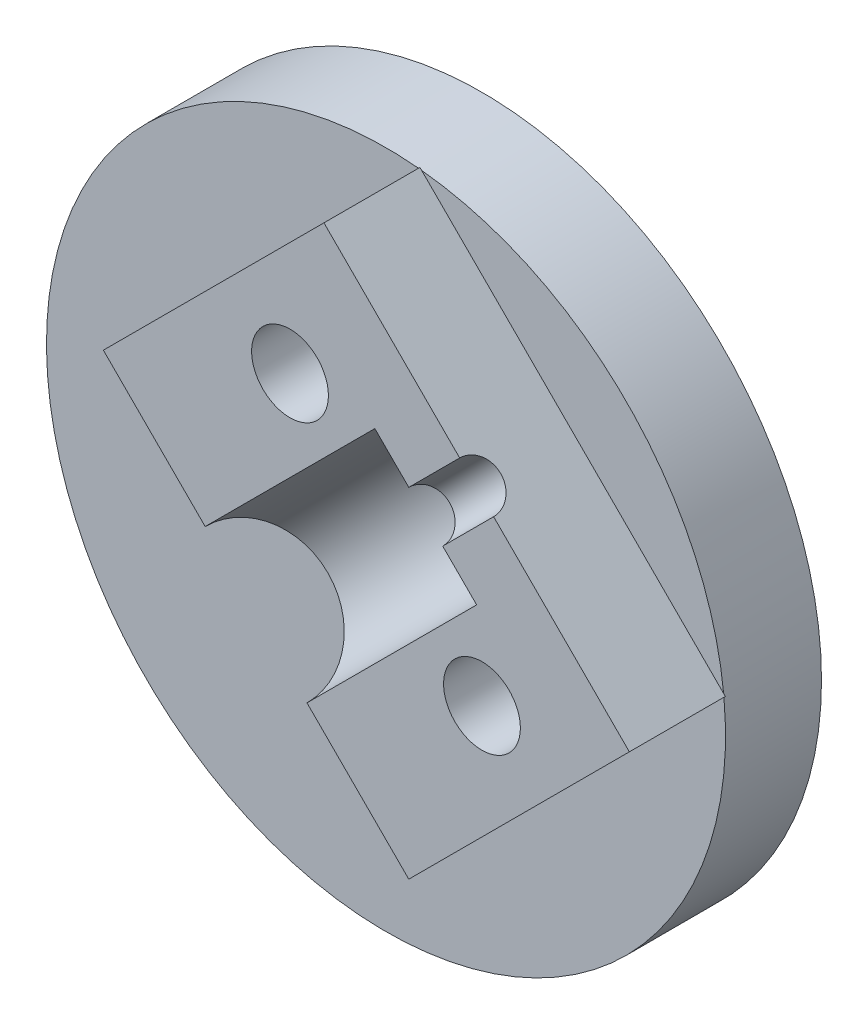
ISO-10303-21;
HEADER;
FILE_DESCRIPTION(('STEP AP214'),'2;1');
FILE_NAME('part.step','',(''),(''),'','','');
FILE_SCHEMA(('AUTOMOTIVE_DESIGN { 1 0 10303 214 1 1 1 1 }'));
ENDSEC;
DATA;
#1=APPLICATION_CONTEXT('core data for automotive mechanical design processes');
#2=APPLICATION_PROTOCOL_DEFINITION('international standard','automotive_design',2000,#1);
#3=PRODUCT_CONTEXT('',#1,'mechanical');
#4=PRODUCT('Part','Part','',(#3));
#5=PRODUCT_RELATED_PRODUCT_CATEGORY('part','',(#4));
#6=PRODUCT_DEFINITION_FORMATION('','',#4);
#7=PRODUCT_DEFINITION_CONTEXT('part definition',#1,'design');
#8=PRODUCT_DEFINITION('design','',#6,#7);
#9=PRODUCT_DEFINITION_SHAPE('','',#8);
#10=(LENGTH_UNIT() NAMED_UNIT(*) SI_UNIT(.MILLI.,.METRE.));
#11=(NAMED_UNIT(*) PLANE_ANGLE_UNIT() SI_UNIT($,.RADIAN.));
#12=(NAMED_UNIT(*) SI_UNIT($,.STERADIAN.) SOLID_ANGLE_UNIT());
#13=UNCERTAINTY_MEASURE_WITH_UNIT(LENGTH_MEASURE(1.E-05),#10,'distance_accuracy_value','');
#14=(GEOMETRIC_REPRESENTATION_CONTEXT(3) GLOBAL_UNCERTAINTY_ASSIGNED_CONTEXT((#13)) GLOBAL_UNIT_ASSIGNED_CONTEXT((#10,
#11,#12)) REPRESENTATION_CONTEXT('',''));
#15=CARTESIAN_POINT('',(0.,0.,0.));
#16=DIRECTION('',(0.,0.,1.));
#17=DIRECTION('',(1.,0.,0.));
#18=AXIS2_PLACEMENT_3D('',#15,#16,#17);
#19=CARTESIAN_POINT('',(-1.4142135623731,-1.41421356237309,8.));
#20=DIRECTION('',(0.707106781186549,0.707106781186546,0.));
#21=DIRECTION('',(-0.707106781186546,0.707106781186549,0.));
#22=AXIS2_PLACEMENT_3D('',#19,#20,#21);
#23=CYLINDRICAL_SURFACE('',#22,3.);
#24=CARTESIAN_POINT('',(5.65685424949239,5.65685424949237,8.));
#25=DIRECTION('',(0.707106781186549,0.707106781186546,0.));
#26=DIRECTION('',(-0.707106781186546,0.707106781186549,0.));
#27=AXIS2_PLACEMENT_3D('',#24,#25,#26);
#28=CIRCLE('',#27,3.);
#29=CARTESIAN_POINT('',(3.53553390593275,7.77817459305202,8.));
#30=VERTEX_POINT('',#29);
#31=CARTESIAN_POINT('',(7.77817459305203,3.53553390593273,8.));
#32=VERTEX_POINT('',#31);
#33=EDGE_CURVE('E67',#30,#32,#28,.F.);
#34=ORIENTED_EDGE('',*,*,#33,.F.);
#35=DIRECTION('',(0.707106781186549,0.707106781186546,0.));
#36=VECTOR('',#35,1.);
#37=CARTESIAN_POINT('',(-3.53553390593274,0.707106781186552,8.));
#38=LINE('',#37,#36);
#39=CARTESIAN_POINT('',(-3.53553390593274,0.707106781186552,8.));
#40=VERTEX_POINT('',#39);
#41=EDGE_CURVE('E208',#40,#30,#38,.T.);
#42=ORIENTED_EDGE('',*,*,#41,.F.);
#43=CARTESIAN_POINT('',(-1.4142135623731,-1.41421356237309,8.));
#44=DIRECTION('',(0.707106781186549,0.707106781186546,0.));
#45=DIRECTION('',(-0.707106781186546,0.707106781186549,0.));
#46=AXIS2_PLACEMENT_3D('',#43,#44,#45);
#47=CIRCLE('',#46,3.);
#48=CARTESIAN_POINT('',(0.707106781186544,-3.53553390593274,8.));
#49=VERTEX_POINT('',#48);
#50=EDGE_CURVE('E185',#49,#40,#47,.T.);
#51=ORIENTED_EDGE('',*,*,#50,.F.);
#52=DIRECTION('',(0.707106781186549,0.707106781186546,0.));
#53=VECTOR('',#52,1.);
#54=CARTESIAN_POINT('',(0.707106781186544,-3.53553390593274,8.));
#55=LINE('',#54,#53);
#56=EDGE_CURVE('E72',#49,#32,#55,.T.);
#57=ORIENTED_EDGE('',*,*,#56,.T.);
#58=EDGE_LOOP('',(#34,#42,#51,#57));
#59=FACE_BOUND('',#58,.T.);
#60=ADVANCED_FACE('F47',(#59),#23,.F.);
#61=CARTESIAN_POINT('',(0.,0.,4.));
#62=DIRECTION('',(0.,0.,1.));
#63=DIRECTION('',(1.,0.,0.));
#64=AXIS2_PLACEMENT_3D('',#61,#62,#63);
#65=PLANE('',#64);
#66=CARTESIAN_POINT('',(-8.,0.,4.));
#67=DIRECTION('',(0.,0.,1.));
#68=DIRECTION('',(1.,0.,0.));
#69=AXIS2_PLACEMENT_3D('',#66,#67,#68);
#70=CIRCLE('',#69,1.6);
#71=CARTESIAN_POINT('',(-6.4,0.,4.));
#72=VERTEX_POINT('',#71);
#73=EDGE_CURVE('E230',#72,#72,#70,.T.);
#74=ORIENTED_EDGE('',*,*,#73,.F.);
#75=EDGE_LOOP('',(#74));
#76=FACE_BOUND('',#75,.T.);
#77=CARTESIAN_POINT('',(0.,-8.,4.));
#78=DIRECTION('',(0.,0.,1.));
#79=DIRECTION('',(1.,0.,0.));
#80=AXIS2_PLACEMENT_3D('',#77,#78,#79);
#81=CIRCLE('',#80,1.6);
#82=CARTESIAN_POINT('',(1.6,-8.,4.));
#83=VERTEX_POINT('',#82);
#84=EDGE_CURVE('E246',#83,#83,#81,.T.);
#85=ORIENTED_EDGE('',*,*,#84,.F.);
#86=EDGE_LOOP('',(#85));
#87=FACE_BOUND('',#86,.T.);
#88=DIRECTION('',(-0.707106781186546,0.707106781186549,0.));
#89=VECTOR('',#88,1.);
#90=CARTESIAN_POINT('',(-1.4142135623731,-1.41421356237309,4.));
#91=LINE('',#90,#89);
#92=CARTESIAN_POINT('',(4.94974746830582,-7.77817459305203,4.));
#93=VERTEX_POINT('',#92);
#94=CARTESIAN_POINT('',(-7.77817459305202,4.94974746830585,4.));
#95=VERTEX_POINT('',#94);
#96=EDGE_CURVE('E196',#93,#95,#91,.T.);
#97=ORIENTED_EDGE('',*,*,#96,.T.);
#98=DIRECTION('',(0.707106781186549,0.707106781186546,0.));
#99=VECTOR('',#98,1.);
#100=CARTESIAN_POINT('',(-7.77817459305202,4.94974746830585,4.));
#101=LINE('',#100,#99);
#102=CARTESIAN_POINT('',(1.35623754574008,14.0841596070979,4.));
#103=VERTEX_POINT('',#102);
#104=EDGE_CURVE('E215',#95,#103,#101,.T.);
#105=ORIENTED_EDGE('',*,*,#104,.T.);
#106=CARTESIAN_POINT('',(0.,0.,4.));
#107=DIRECTION('',(0.,0.,1.));
#108=DIRECTION('',(1.,0.,0.));
#109=AXIS2_PLACEMENT_3D('',#106,#107,#108);
#110=CIRCLE('',#109,14.1493085385358);
#111=CARTESIAN_POINT('',(14.0841596070979,1.35623754574003,4.));
#112=VERTEX_POINT('',#111);
#113=EDGE_CURVE('E254',#103,#112,#110,.T.);
#114=ORIENTED_EDGE('',*,*,#113,.T.);
#115=DIRECTION('',(0.707106781186549,0.707106781186546,0.));
#116=VECTOR('',#115,1.);
#117=CARTESIAN_POINT('',(4.94974746830582,-7.77817459305203,4.));
#118=LINE('',#117,#116);
#119=EDGE_CURVE('E220',#93,#112,#118,.T.);
#120=ORIENTED_EDGE('',*,*,#119,.F.);
#121=EDGE_LOOP('',(#97,#105,#114,#120));
#122=FACE_BOUND('',#121,.T.);
#123=ADVANCED_FACE('F304',(#76,#87,#122),#65,.T.);
#124=DIRECTION('',(-0.707106781186546,0.707106781186549,0.));
#125=VECTOR('',#124,1.);
#126=CARTESIAN_POINT('',(7.77817459305204,7.77817459305201,4.));
#127=LINE('',#126,#125);
#128=CARTESIAN_POINT('',(14.0711441670562,1.48520501904787,4.));
#129=VERTEX_POINT('',#128);
#130=CARTESIAN_POINT('',(1.48520501904792,14.0711441670561,4.));
#131=VERTEX_POINT('',#130);
#132=EDGE_CURVE('E11',#129,#131,#127,.T.);
#133=ORIENTED_EDGE('',*,*,#132,.F.);
#134=EDGE_CURVE('E253',#129,#131,#110,.T.);
#135=ORIENTED_EDGE('',*,*,#134,.T.);
#136=EDGE_LOOP('',(#133,#135));
#137=FACE_BOUND('',#136,.T.);
#138=ADVANCED_FACE('F275',(#137),#65,.T.);
#139=CARTESIAN_POINT('',(0.,0.,0.));
#140=DIRECTION('',(0.,0.,1.));
#141=DIRECTION('',(1.,0.,0.));
#142=AXIS2_PLACEMENT_3D('',#139,#140,#141);
#143=PLANE('',#142);
#144=CARTESIAN_POINT('',(0.,0.,0.));
#145=DIRECTION('',(0.,0.,1.));
#146=DIRECTION('',(1.,0.,0.));
#147=AXIS2_PLACEMENT_3D('',#144,#145,#146);
#148=CIRCLE('',#147,14.1493085385358);
#149=CARTESIAN_POINT('',(14.1493085385358,0.,0.));
#150=VERTEX_POINT('',#149);
#151=EDGE_CURVE('E51',#150,#150,#148,.T.);
#152=ORIENTED_EDGE('',*,*,#151,.F.);
#153=EDGE_LOOP('',(#152));
#154=FACE_BOUND('',#153,.T.);
#155=CARTESIAN_POINT('',(0.,-8.,0.));
#156=DIRECTION('',(0.,0.,1.));
#157=DIRECTION('',(1.,0.,0.));
#158=AXIS2_PLACEMENT_3D('',#155,#156,#157);
#159=CIRCLE('',#158,1.6);
#160=CARTESIAN_POINT('',(1.6,-8.,0.));
#161=VERTEX_POINT('',#160);
#162=EDGE_CURVE('E245',#161,#161,#159,.T.);
#163=ORIENTED_EDGE('',*,*,#162,.T.);
#164=EDGE_LOOP('',(#163));
#165=FACE_BOUND('',#164,.T.);
#166=CARTESIAN_POINT('',(8.,0.,0.));
#167=DIRECTION('',(0.,0.,1.));
#168=DIRECTION('',(1.,0.,0.));
#169=AXIS2_PLACEMENT_3D('',#166,#167,#168);
#170=CIRCLE('',#169,1.6);
#171=CARTESIAN_POINT('',(9.6,0.,0.));
#172=VERTEX_POINT('',#171);
#173=EDGE_CURVE('E241',#172,#172,#170,.T.);
#174=ORIENTED_EDGE('',*,*,#173,.T.);
#175=EDGE_LOOP('',(#174));
#176=FACE_BOUND('',#175,.T.);
#177=CARTESIAN_POINT('',(0.,8.,0.));
#178=DIRECTION('',(0.,0.,1.));
#179=DIRECTION('',(1.,0.,0.));
#180=AXIS2_PLACEMENT_3D('',#177,#178,#179);
#181=CIRCLE('',#180,1.6);
#182=CARTESIAN_POINT('',(1.6,8.,0.));
#183=VERTEX_POINT('',#182);
#184=EDGE_CURVE('E234',#183,#183,#181,.T.);
#185=ORIENTED_EDGE('',*,*,#184,.T.);
#186=EDGE_LOOP('',(#185));
#187=FACE_BOUND('',#186,.T.);
#188=CARTESIAN_POINT('',(-8.,0.,0.));
#189=DIRECTION('',(0.,0.,1.));
#190=DIRECTION('',(1.,0.,0.));
#191=AXIS2_PLACEMENT_3D('',#188,#189,#190);
#192=CIRCLE('',#191,1.6);
#193=CARTESIAN_POINT('',(-6.4,0.,0.));
#194=VERTEX_POINT('',#193);
#195=EDGE_CURVE('E211',#194,#194,#192,.T.);
#196=ORIENTED_EDGE('',*,*,#195,.T.);
#197=EDGE_LOOP('',(#196));
#198=FACE_BOUND('',#197,.T.);
#199=ADVANCED_FACE('F272',(#154,#165,#176,#187,#198),#143,.F.);
#200=CARTESIAN_POINT('',(0.,0.,4.));
#201=DIRECTION('',(0.,0.,-1.));
#202=DIRECTION('',(-1.,0.,0.));
#203=AXIS2_PLACEMENT_3D('',#200,#201,#202);
#204=CYLINDRICAL_SURFACE('',#203,14.1493085385358);
#205=EDGE_CURVE('E57',#112,#129,#110,.T.);
#206=ORIENTED_EDGE('',*,*,#205,.F.);
#207=ORIENTED_EDGE('',*,*,#113,.F.);
#208=EDGE_CURVE('E260',#131,#103,#110,.T.);
#209=ORIENTED_EDGE('',*,*,#208,.F.);
#210=ORIENTED_EDGE('',*,*,#134,.F.);
#211=EDGE_LOOP('',(#206,#207,#209,#210));
#212=FACE_BOUND('',#211,.T.);
#213=ORIENTED_EDGE('',*,*,#151,.T.);
#214=EDGE_LOOP('',(#213));
#215=FACE_BOUND('',#214,.T.);
#216=ADVANCED_FACE('F49',(#212,#215),#204,.T.);
#217=CARTESIAN_POINT('',(0.,-8.,4.));
#218=DIRECTION('',(0.,0.,-1.));
#219=DIRECTION('',(-1.,0.,0.));
#220=AXIS2_PLACEMENT_3D('',#217,#218,#219);
#221=CYLINDRICAL_SURFACE('',#220,1.6);
#222=ORIENTED_EDGE('',*,*,#84,.T.);
#223=EDGE_LOOP('',(#222));
#224=FACE_BOUND('',#223,.T.);
#225=ORIENTED_EDGE('',*,*,#162,.F.);
#226=EDGE_LOOP('',(#225));
#227=FACE_BOUND('',#226,.T.);
#228=ADVANCED_FACE('F385',(#224,#227),#221,.F.);
#229=CARTESIAN_POINT('',(8.,0.,4.));
#230=DIRECTION('',(0.,0.,-1.));
#231=DIRECTION('',(-1.,0.,0.));
#232=AXIS2_PLACEMENT_3D('',#229,#230,#231);
#233=CYLINDRICAL_SURFACE('',#232,1.6);
#234=ORIENTED_EDGE('',*,*,#173,.F.);
#235=EDGE_LOOP('',(#234));
#236=FACE_BOUND('',#235,.T.);
#237=CARTESIAN_POINT('',(8.,0.,8.));
#238=DIRECTION('',(0.,0.,1.));
#239=DIRECTION('',(1.,0.,0.));
#240=AXIS2_PLACEMENT_3D('',#237,#238,#239);
#241=CIRCLE('',#240,1.6);
#242=CARTESIAN_POINT('',(9.6,0.,8.));
#243=VERTEX_POINT('',#242);
#244=EDGE_CURVE('E163',#243,#243,#241,.T.);
#245=ORIENTED_EDGE('',*,*,#244,.T.);
#246=EDGE_LOOP('',(#245));
#247=FACE_BOUND('',#246,.T.);
#248=ADVANCED_FACE('F299',(#236,#247),#233,.F.);
#249=CARTESIAN_POINT('',(0.,8.,4.));
#250=DIRECTION('',(0.,0.,-1.));
#251=DIRECTION('',(-1.,0.,0.));
#252=AXIS2_PLACEMENT_3D('',#249,#250,#251);
#253=CYLINDRICAL_SURFACE('',#252,1.6);
#254=ORIENTED_EDGE('',*,*,#184,.F.);
#255=EDGE_LOOP('',(#254));
#256=FACE_BOUND('',#255,.T.);
#257=CARTESIAN_POINT('',(0.,8.,8.));
#258=DIRECTION('',(0.,0.,1.));
#259=DIRECTION('',(1.,0.,0.));
#260=AXIS2_PLACEMENT_3D('',#257,#258,#259);
#261=CIRCLE('',#260,1.6);
#262=CARTESIAN_POINT('',(1.6,8.,8.));
#263=VERTEX_POINT('',#262);
#264=EDGE_CURVE('E161',#263,#263,#261,.T.);
#265=ORIENTED_EDGE('',*,*,#264,.T.);
#266=EDGE_LOOP('',(#265));
#267=FACE_BOUND('',#266,.T.);
#268=ADVANCED_FACE('F287',(#256,#267),#253,.F.);
#269=CARTESIAN_POINT('',(-8.,0.,4.));
#270=DIRECTION('',(0.,0.,-1.));
#271=DIRECTION('',(-1.,0.,0.));
#272=AXIS2_PLACEMENT_3D('',#269,#270,#271);
#273=CYLINDRICAL_SURFACE('',#272,1.6);
#274=ORIENTED_EDGE('',*,*,#73,.T.);
#275=EDGE_LOOP('',(#274));
#276=FACE_BOUND('',#275,.T.);
#277=ORIENTED_EDGE('',*,*,#195,.F.);
#278=EDGE_LOOP('',(#277));
#279=FACE_BOUND('',#278,.T.);
#280=ADVANCED_FACE('F284',(#276,#279),#273,.F.);
#281=CARTESIAN_POINT('',(7.77817459305204,7.77817459305201,0.));
#282=DIRECTION('',(0.707106781186549,0.707106781186546,0.));
#283=DIRECTION('',(-0.707106781186546,0.707106781186549,0.));
#284=AXIS2_PLACEMENT_3D('',#281,#282,#283);
#285=PLANE('',#284);
#286=DIRECTION('',(0.707106781186546,-0.707106781186549,0.));
#287=VECTOR('',#286,1.);
#288=CARTESIAN_POINT('',(7.77817459305204,7.77817459305201,8.));
#289=LINE('',#288,#287);
#290=CARTESIAN_POINT('',(1.41421356237312,14.1421356237309,8.));
#291=VERTEX_POINT('',#290);
#292=CARTESIAN_POINT('',(7.07106781186549,8.48528137423856,8.));
#293=VERTEX_POINT('',#292);
#294=EDGE_CURVE('E182',#291,#293,#289,.T.);
#295=ORIENTED_EDGE('',*,*,#294,.T.);
#296=CARTESIAN_POINT('',(7.77817459305203,7.77817459305201,8.));
#297=DIRECTION('',(0.707106781186549,0.707106781186546,0.));
#298=DIRECTION('',(-0.707106781186546,0.707106781186549,0.));
#299=AXIS2_PLACEMENT_3D('',#296,#297,#298);
#300=CIRCLE('',#299,1.);
#301=CARTESIAN_POINT('',(8.48528137423858,7.07106781186546,8.));
#302=VERTEX_POINT('',#301);
#303=EDGE_CURVE('E153',#302,#293,#300,.T.);
#304=ORIENTED_EDGE('',*,*,#303,.F.);
#305=DIRECTION('',(0.707106781186546,-0.707106781186549,0.));
#306=VECTOR('',#305,1.);
#307=CARTESIAN_POINT('',(7.77817459305204,7.77817459305201,8.));
#308=LINE('',#307,#306);
#309=CARTESIAN_POINT('',(14.142135623731,1.41421356237307,8.));
#310=VERTEX_POINT('',#309);
#311=EDGE_CURVE('E143',#302,#310,#308,.T.);
#312=ORIENTED_EDGE('',*,*,#311,.T.);
#313=DIRECTION('',(0.,0.,-1.));
#314=VECTOR('',#313,1.);
#315=CARTESIAN_POINT('',(14.142135623731,1.41421356237307,0.));
#316=LINE('',#315,#314);
#317=CARTESIAN_POINT('',(14.142135623731,1.41421356237307,4.));
#318=VERTEX_POINT('',#317);
#319=EDGE_CURVE('E172',#310,#318,#316,.T.);
#320=ORIENTED_EDGE('',*,*,#319,.T.);
#321=EDGE_CURVE('E59',#318,#129,#127,.T.);
#322=ORIENTED_EDGE('',*,*,#321,.T.);
#323=ORIENTED_EDGE('',*,*,#132,.T.);
#324=CARTESIAN_POINT('',(1.41421356237312,14.1421356237309,4.));
#325=VERTEX_POINT('',#324);
#326=EDGE_CURVE('E60',#131,#325,#127,.T.);
#327=ORIENTED_EDGE('',*,*,#326,.T.);
#328=DIRECTION('',(0.,0.,1.));
#329=VECTOR('',#328,1.);
#330=CARTESIAN_POINT('',(1.41421356237311,14.142135623731,0.));
#331=LINE('',#330,#329);
#332=EDGE_CURVE('E178',#325,#291,#331,.T.);
#333=ORIENTED_EDGE('',*,*,#332,.T.);
#334=EDGE_LOOP('',(#295,#304,#312,#320,#322,#323,#327,#333));
#335=FACE_BOUND('',#334,.T.);
#336=ADVANCED_FACE('F286',(#335),#285,.T.);
#337=CARTESIAN_POINT('',(-1.4142135623731,-1.41421356237309,0.));
#338=DIRECTION('',(0.707106781186549,0.707106781186546,0.));
#339=DIRECTION('',(-0.707106781186546,0.707106781186549,0.));
#340=AXIS2_PLACEMENT_3D('',#337,#338,#339);
#341=PLANE('',#340);
#342=ORIENTED_EDGE('',*,*,#50,.T.);
#343=DIRECTION('',(0.707106781186546,-0.707106781186549,0.));
#344=VECTOR('',#343,1.);
#345=CARTESIAN_POINT('',(-1.4142135623731,-1.41421356237309,8.));
#346=LINE('',#345,#344);
#347=CARTESIAN_POINT('',(-7.77817459305202,4.94974746830585,8.));
#348=VERTEX_POINT('',#347);
#349=EDGE_CURVE('E204',#348,#40,#346,.T.);
#350=ORIENTED_EDGE('',*,*,#349,.F.);
#351=DIRECTION('',(0.,0.,1.));
#352=VECTOR('',#351,1.);
#353=CARTESIAN_POINT('',(-7.77817459305202,4.94974746830585,0.));
#354=LINE('',#353,#352);
#355=EDGE_CURVE('E200',#95,#348,#354,.T.);
#356=ORIENTED_EDGE('',*,*,#355,.F.);
#357=ORIENTED_EDGE('',*,*,#96,.F.);
#358=DIRECTION('',(0.,0.,-1.));
#359=VECTOR('',#358,1.);
#360=CARTESIAN_POINT('',(4.94974746830582,-7.77817459305203,0.));
#361=LINE('',#360,#359);
#362=CARTESIAN_POINT('',(4.94974746830582,-7.77817459305203,8.));
#363=VERTEX_POINT('',#362);
#364=EDGE_CURVE('E192',#363,#93,#361,.T.);
#365=ORIENTED_EDGE('',*,*,#364,.F.);
#366=DIRECTION('',(0.707106781186546,-0.707106781186549,0.));
#367=VECTOR('',#366,1.);
#368=CARTESIAN_POINT('',(-1.4142135623731,-1.41421356237309,8.));
#369=LINE('',#368,#367);
#370=EDGE_CURVE('E188',#49,#363,#369,.T.);
#371=ORIENTED_EDGE('',*,*,#370,.F.);
#372=EDGE_LOOP('',(#342,#350,#356,#357,#365,#371));
#373=FACE_BOUND('',#372,.T.);
#374=ADVANCED_FACE('F295',(#373),#341,.F.);
#375=CARTESIAN_POINT('',(-1.4142135623731,-1.41421356237309,8.));
#376=DIRECTION('',(0.,0.,1.));
#377=DIRECTION('',(1.,0.,0.));
#378=AXIS2_PLACEMENT_3D('',#375,#376,#377);
#379=PLANE('',#378);
#380=ORIENTED_EDGE('',*,*,#244,.F.);
#381=EDGE_LOOP('',(#380));
#382=FACE_BOUND('',#381,.T.);
#383=DIRECTION('',(0.707106781186549,0.707106781186546,0.));
#384=VECTOR('',#383,1.);
#385=CARTESIAN_POINT('',(4.94974746830582,-7.77817459305203,8.));
#386=LINE('',#385,#384);
#387=EDGE_CURVE('E225',#363,#310,#386,.T.);
#388=ORIENTED_EDGE('',*,*,#387,.T.);
#389=ORIENTED_EDGE('',*,*,#311,.F.);
#390=DIRECTION('',(0.707106781186548,0.707106781186546,0.));
#391=VECTOR('',#390,1.);
#392=CARTESIAN_POINT('',(6.36396103067893,4.94974746830582,8.));
#393=LINE('',#392,#391);
#394=CARTESIAN_POINT('',(6.36396103067893,4.94974746830582,8.));
#395=VERTEX_POINT('',#394);
#396=EDGE_CURVE('E140',#395,#302,#393,.T.);
#397=ORIENTED_EDGE('',*,*,#396,.F.);
#398=DIRECTION('',(-0.707106781186546,0.707106781186549,0.));
#399=VECTOR('',#398,1.);
#400=CARTESIAN_POINT('',(5.65685424949239,5.65685424949238,8.));
#401=LINE('',#400,#399);
#402=EDGE_CURVE('E128',#32,#395,#401,.T.);
#403=ORIENTED_EDGE('',*,*,#402,.F.);
#404=ORIENTED_EDGE('',*,*,#56,.F.);
#405=ORIENTED_EDGE('',*,*,#370,.T.);
#406=EDGE_LOOP('',(#388,#389,#397,#403,#404,#405));
#407=FACE_BOUND('',#406,.T.);
#408=ADVANCED_FACE('F141',(#382,#407),#379,.T.);
#409=CARTESIAN_POINT('',(4.94974746830582,-7.77817459305203,0.));
#410=DIRECTION('',(0.707106781186546,-0.707106781186549,0.));
#411=DIRECTION('',(0.707106781186549,0.707106781186546,0.));
#412=AXIS2_PLACEMENT_3D('',#409,#410,#411);
#413=PLANE('',#412);
#414=ORIENTED_EDGE('',*,*,#119,.T.);
#415=EDGE_CURVE('E224',#112,#318,#118,.T.);
#416=ORIENTED_EDGE('',*,*,#415,.T.);
#417=ORIENTED_EDGE('',*,*,#319,.F.);
#418=ORIENTED_EDGE('',*,*,#387,.F.);
#419=ORIENTED_EDGE('',*,*,#364,.T.);
#420=EDGE_LOOP('',(#414,#416,#417,#418,#419));
#421=FACE_BOUND('',#420,.T.);
#422=ADVANCED_FACE('F312',(#421),#413,.T.);
#423=CARTESIAN_POINT('',(-1.4142135623731,-1.41421356237309,4.));
#424=DIRECTION('',(0.,0.,-1.));
#425=DIRECTION('',(0.,1.,0.));
#426=AXIS2_PLACEMENT_3D('',#423,#424,#425);
#427=PLANE('',#426);
#428=ORIENTED_EDGE('',*,*,#326,.F.);
#429=ORIENTED_EDGE('',*,*,#208,.T.);
#430=EDGE_CURVE('E219',#103,#325,#101,.T.);
#431=ORIENTED_EDGE('',*,*,#430,.T.);
#432=EDGE_LOOP('',(#428,#429,#431));
#433=FACE_BOUND('',#432,.T.);
#434=ADVANCED_FACE('F316',(#433),#427,.T.);
#435=CARTESIAN_POINT('',(-7.77817459305202,4.94974746830585,0.));
#436=DIRECTION('',(-0.707106781186546,0.707106781186549,0.));
#437=DIRECTION('',(-0.707106781186549,-0.707106781186546,0.));
#438=AXIS2_PLACEMENT_3D('',#435,#436,#437);
#439=PLANE('',#438);
#440=DIRECTION('',(0.707106781186549,0.707106781186546,0.));
#441=VECTOR('',#440,1.);
#442=CARTESIAN_POINT('',(-7.77817459305202,4.94974746830585,8.));
#443=LINE('',#442,#441);
#444=EDGE_CURVE('E212',#348,#291,#443,.T.);
#445=ORIENTED_EDGE('',*,*,#444,.T.);
#446=ORIENTED_EDGE('',*,*,#332,.F.);
#447=ORIENTED_EDGE('',*,*,#430,.F.);
#448=ORIENTED_EDGE('',*,*,#104,.F.);
#449=ORIENTED_EDGE('',*,*,#355,.T.);
#450=EDGE_LOOP('',(#445,#446,#447,#448,#449));
#451=FACE_BOUND('',#450,.T.);
#452=ADVANCED_FACE('F320',(#451),#439,.T.);
#453=CARTESIAN_POINT('',(-1.4142135623731,-1.41421356237309,8.));
#454=DIRECTION('',(0.,0.,1.));
#455=DIRECTION('',(0.,-1.,0.));
#456=AXIS2_PLACEMENT_3D('',#453,#454,#455);
#457=PLANE('',#456);
#458=ORIENTED_EDGE('',*,*,#264,.F.);
#459=EDGE_LOOP('',(#458));
#460=FACE_BOUND('',#459,.T.);
#461=ORIENTED_EDGE('',*,*,#41,.T.);
#462=CARTESIAN_POINT('',(4.94974746830584,6.36396103067892,8.));
#463=VERTEX_POINT('',#462);
#464=EDGE_CURVE('E138',#463,#30,#401,.T.);
#465=ORIENTED_EDGE('',*,*,#464,.F.);
#466=DIRECTION('',(0.707106781186548,0.707106781186546,0.));
#467=VECTOR('',#466,1.);
#468=CARTESIAN_POINT('',(4.94974746830584,6.36396103067892,8.));
#469=LINE('',#468,#467);
#470=EDGE_CURVE('E148',#463,#293,#469,.T.);
#471=ORIENTED_EDGE('',*,*,#470,.T.);
#472=ORIENTED_EDGE('',*,*,#294,.F.);
#473=ORIENTED_EDGE('',*,*,#444,.F.);
#474=ORIENTED_EDGE('',*,*,#349,.T.);
#475=EDGE_LOOP('',(#461,#465,#471,#472,#473,#474));
#476=FACE_BOUND('',#475,.T.);
#477=ADVANCED_FACE('F325',(#460,#476),#457,.T.);
#478=ORIENTED_EDGE('',*,*,#415,.F.);
#479=ORIENTED_EDGE('',*,*,#205,.T.);
#480=ORIENTED_EDGE('',*,*,#321,.F.);
#481=EDGE_LOOP('',(#478,#479,#480));
#482=FACE_BOUND('',#481,.T.);
#483=ADVANCED_FACE('F322',(#482),#427,.T.);
#484=CARTESIAN_POINT('',(5.65685424949239,5.65685424949237,8.));
#485=DIRECTION('',(0.707106781186548,0.707106781186546,0.));
#486=DIRECTION('',(-0.707106781186546,0.707106781186549,0.));
#487=AXIS2_PLACEMENT_3D('',#484,#485,#486);
#488=CYLINDRICAL_SURFACE('',#487,1.);
#489=ORIENTED_EDGE('',*,*,#303,.T.);
#490=ORIENTED_EDGE('',*,*,#470,.F.);
#491=CARTESIAN_POINT('',(5.65685424949239,5.65685424949237,8.));
#492=DIRECTION('',(0.707106781186549,0.707106781186546,0.));
#493=DIRECTION('',(-0.707106781186546,0.707106781186549,0.));
#494=AXIS2_PLACEMENT_3D('',#491,#492,#493);
#495=CIRCLE('',#494,1.);
#496=EDGE_CURVE('E133',#395,#463,#495,.T.);
#497=ORIENTED_EDGE('',*,*,#496,.F.);
#498=ORIENTED_EDGE('',*,*,#396,.T.);
#499=EDGE_LOOP('',(#489,#490,#497,#498));
#500=FACE_BOUND('',#499,.T.);
#501=ADVANCED_FACE('F150',(#500),#488,.F.);
#502=CARTESIAN_POINT('',(5.65685424949239,5.65685424949237,0.));
#503=DIRECTION('',(0.707106781186549,0.707106781186546,0.));
#504=DIRECTION('',(-0.707106781186546,0.707106781186549,0.));
#505=AXIS2_PLACEMENT_3D('',#502,#503,#504);
#506=PLANE('',#505);
#507=ORIENTED_EDGE('',*,*,#496,.T.);
#508=ORIENTED_EDGE('',*,*,#464,.T.);
#509=ORIENTED_EDGE('',*,*,#33,.T.);
#510=ORIENTED_EDGE('',*,*,#402,.T.);
#511=EDGE_LOOP('',(#507,#508,#509,#510));
#512=FACE_BOUND('',#511,.T.);
#513=ADVANCED_FACE('F130',(#512),#506,.F.);
#514=CLOSED_SHELL('',(#60,#123,#138,#199,#216,#228,#248,#268,#280,#336,#374,#408,#422,#434,#452,
#477,#483,#501,#513));
#515=MANIFOLD_SOLID_BREP('B2',#514);
#516=ADVANCED_BREP_SHAPE_REPRESENTATION('',(#18,#515),#14);
#517=SHAPE_DEFINITION_REPRESENTATION(#9,#516);
ENDSEC;
END-ISO-10303-21;
